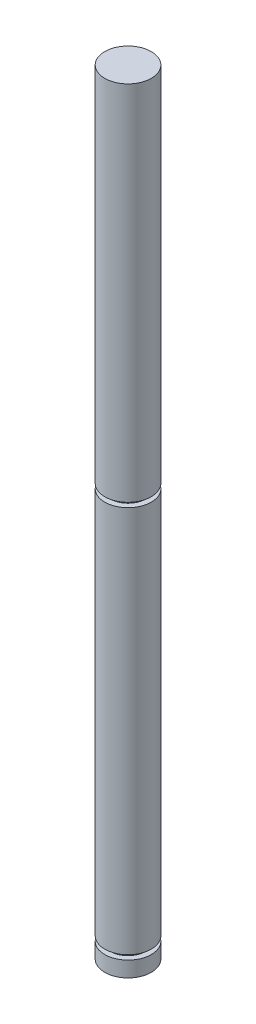
ISO-10303-21;
HEADER;
FILE_DESCRIPTION(('STEP AP214'),'2;1');
FILE_NAME('part.step','',(''),(''),'','','');
FILE_SCHEMA(('AUTOMOTIVE_DESIGN { 1 0 10303 214 1 1 1 1 }'));
ENDSEC;
DATA;
#1=APPLICATION_CONTEXT('core data for automotive mechanical design processes');
#2=APPLICATION_PROTOCOL_DEFINITION('international standard','automotive_design',2000,#1);
#3=PRODUCT_CONTEXT('',#1,'mechanical');
#4=PRODUCT('Part','Part','',(#3));
#5=PRODUCT_RELATED_PRODUCT_CATEGORY('part','',(#4));
#6=PRODUCT_DEFINITION_FORMATION('','',#4);
#7=PRODUCT_DEFINITION_CONTEXT('part definition',#1,'design');
#8=PRODUCT_DEFINITION('design','',#6,#7);
#9=PRODUCT_DEFINITION_SHAPE('','',#8);
#10=(LENGTH_UNIT() NAMED_UNIT(*) SI_UNIT(.MILLI.,.METRE.));
#11=(NAMED_UNIT(*) PLANE_ANGLE_UNIT() SI_UNIT($,.RADIAN.));
#12=(NAMED_UNIT(*) SI_UNIT($,.STERADIAN.) SOLID_ANGLE_UNIT());
#13=UNCERTAINTY_MEASURE_WITH_UNIT(LENGTH_MEASURE(1.E-05),#10,'distance_accuracy_value','');
#14=(GEOMETRIC_REPRESENTATION_CONTEXT(3) GLOBAL_UNCERTAINTY_ASSIGNED_CONTEXT((#13)) GLOBAL_UNIT_ASSIGNED_CONTEXT((#10,
#11,#12)) REPRESENTATION_CONTEXT('',''));
#15=CARTESIAN_POINT('',(0.,0.,0.));
#16=DIRECTION('',(0.,0.,1.));
#17=DIRECTION('',(1.,0.,0.));
#18=AXIS2_PLACEMENT_3D('',#15,#16,#17);
#19=CARTESIAN_POINT('',(0.,0.,0.));
#20=DIRECTION('',(0.,-1.,0.));
#21=DIRECTION('',(0.,0.,-1.));
#22=AXIS2_PLACEMENT_3D('',#19,#20,#21);
#23=PLANE('',#22);
#24=CARTESIAN_POINT('',(0.,0.,0.));
#25=DIRECTION('',(0.,-1.,0.));
#26=DIRECTION('',(0.,0.,-1.));
#27=AXIS2_PLACEMENT_3D('',#24,#25,#26);
#28=CIRCLE('',#27,7.5);
#29=CARTESIAN_POINT('',(0.,0.,-7.5));
#30=VERTEX_POINT('',#29);
#31=EDGE_CURVE('E12',#30,#30,#28,.T.);
#32=ORIENTED_EDGE('',*,*,#31,.T.);
#33=EDGE_LOOP('',(#32));
#34=FACE_BOUND('',#33,.T.);
#35=ADVANCED_FACE('F40',(#34),#23,.T.);
#36=CARTESIAN_POINT('',(0.,0.,0.));
#37=DIRECTION('',(0.,-1.,0.));
#38=DIRECTION('',(0.,0.,-1.));
#39=AXIS2_PLACEMENT_3D('',#36,#37,#38);
#40=CYLINDRICAL_SURFACE('',#39,7.5);
#41=CARTESIAN_POINT('',(0.,5.,0.));
#42=DIRECTION('',(0.,-1.,0.));
#43=DIRECTION('',(0.,0.,-1.));
#44=AXIS2_PLACEMENT_3D('',#41,#42,#43);
#45=CIRCLE('',#44,7.5);
#46=CARTESIAN_POINT('',(0.,5.,-7.5));
#47=VERTEX_POINT('',#46);
#48=EDGE_CURVE('E46',#47,#47,#45,.T.);
#49=ORIENTED_EDGE('',*,*,#48,.T.);
#50=EDGE_LOOP('',(#49));
#51=FACE_BOUND('',#50,.T.);
#52=ORIENTED_EDGE('',*,*,#31,.F.);
#53=EDGE_LOOP('',(#52));
#54=FACE_BOUND('',#53,.T.);
#55=ADVANCED_FACE('F90',(#51,#54),#40,.T.);
#56=CARTESIAN_POINT('',(7.5,5.,0.));
#57=DIRECTION('',(0.,1.,0.));
#58=DIRECTION('',(0.,0.,1.));
#59=AXIS2_PLACEMENT_3D('',#56,#57,#58);
#60=PLANE('',#59);
#61=CARTESIAN_POINT('',(0.,5.,0.));
#62=DIRECTION('',(0.,-1.,0.));
#63=DIRECTION('',(0.,0.,-1.));
#64=AXIS2_PLACEMENT_3D('',#61,#62,#63);
#65=CIRCLE('',#64,5.75);
#66=CARTESIAN_POINT('',(0.,5.,-5.75));
#67=VERTEX_POINT('',#66);
#68=EDGE_CURVE('E50',#67,#67,#65,.T.);
#69=ORIENTED_EDGE('',*,*,#68,.T.);
#70=EDGE_LOOP('',(#69));
#71=FACE_BOUND('',#70,.T.);
#72=ORIENTED_EDGE('',*,*,#48,.F.);
#73=EDGE_LOOP('',(#72));
#74=FACE_BOUND('',#73,.T.);
#75=ADVANCED_FACE('F94',(#71,#74),#60,.T.);
#76=CARTESIAN_POINT('',(0.,0.,0.));
#77=DIRECTION('',(0.,-1.,0.));
#78=DIRECTION('',(0.,0.,-1.));
#79=AXIS2_PLACEMENT_3D('',#76,#77,#78);
#80=CYLINDRICAL_SURFACE('',#79,5.75);
#81=CARTESIAN_POINT('',(0.,6.5,0.));
#82=DIRECTION('',(0.,-1.,0.));
#83=DIRECTION('',(0.,0.,-1.));
#84=AXIS2_PLACEMENT_3D('',#81,#82,#83);
#85=CIRCLE('',#84,5.75);
#86=CARTESIAN_POINT('',(0.,6.5,-5.75));
#87=VERTEX_POINT('',#86);
#88=EDGE_CURVE('E54',#87,#87,#85,.T.);
#89=ORIENTED_EDGE('',*,*,#88,.T.);
#90=EDGE_LOOP('',(#89));
#91=FACE_BOUND('',#90,.T.);
#92=ORIENTED_EDGE('',*,*,#68,.F.);
#93=EDGE_LOOP('',(#92));
#94=FACE_BOUND('',#93,.T.);
#95=ADVANCED_FACE('F98',(#91,#94),#80,.T.);
#96=CARTESIAN_POINT('',(5.75,6.5,0.));
#97=DIRECTION('',(0.,-1.,0.));
#98=DIRECTION('',(0.,0.,-1.));
#99=AXIS2_PLACEMENT_3D('',#96,#97,#98);
#100=PLANE('',#99);
#101=CARTESIAN_POINT('',(0.,6.5,0.));
#102=DIRECTION('',(0.,-1.,0.));
#103=DIRECTION('',(0.,0.,-1.));
#104=AXIS2_PLACEMENT_3D('',#101,#102,#103);
#105=CIRCLE('',#104,7.5);
#106=CARTESIAN_POINT('',(0.,6.5,-7.5));
#107=VERTEX_POINT('',#106);
#108=EDGE_CURVE('E59',#107,#107,#105,.T.);
#109=ORIENTED_EDGE('',*,*,#108,.T.);
#110=EDGE_LOOP('',(#109));
#111=FACE_BOUND('',#110,.T.);
#112=ORIENTED_EDGE('',*,*,#88,.F.);
#113=EDGE_LOOP('',(#112));
#114=FACE_BOUND('',#113,.T.);
#115=ADVANCED_FACE('F105',(#111,#114),#100,.T.);
#116=CARTESIAN_POINT('',(0.,0.,0.));
#117=DIRECTION('',(0.,-1.,0.));
#118=DIRECTION('',(0.,0.,-1.));
#119=AXIS2_PLACEMENT_3D('',#116,#117,#118);
#120=CYLINDRICAL_SURFACE('',#119,7.5);
#121=CARTESIAN_POINT('',(0.,131.5,0.));
#122=DIRECTION('',(0.,-1.,0.));
#123=DIRECTION('',(0.,0.,-1.));
#124=AXIS2_PLACEMENT_3D('',#121,#122,#123);
#125=CIRCLE('',#124,7.5);
#126=CARTESIAN_POINT('',(0.,131.5,-7.5));
#127=VERTEX_POINT('',#126);
#128=EDGE_CURVE('E62',#127,#127,#125,.T.);
#129=ORIENTED_EDGE('',*,*,#128,.T.);
#130=EDGE_LOOP('',(#129));
#131=FACE_BOUND('',#130,.T.);
#132=ORIENTED_EDGE('',*,*,#108,.F.);
#133=EDGE_LOOP('',(#132));
#134=FACE_BOUND('',#133,.T.);
#135=ADVANCED_FACE('F109',(#131,#134),#120,.T.);
#136=CARTESIAN_POINT('',(7.5,131.5,0.));
#137=DIRECTION('',(0.,1.,0.));
#138=DIRECTION('',(0.,0.,1.));
#139=AXIS2_PLACEMENT_3D('',#136,#137,#138);
#140=PLANE('',#139);
#141=CARTESIAN_POINT('',(0.,131.5,0.));
#142=DIRECTION('',(0.,-1.,0.));
#143=DIRECTION('',(0.,0.,-1.));
#144=AXIS2_PLACEMENT_3D('',#141,#142,#143);
#145=CIRCLE('',#144,5.75);
#146=CARTESIAN_POINT('',(0.,131.5,-5.75));
#147=VERTEX_POINT('',#146);
#148=EDGE_CURVE('E65',#147,#147,#145,.T.);
#149=ORIENTED_EDGE('',*,*,#148,.T.);
#150=EDGE_LOOP('',(#149));
#151=FACE_BOUND('',#150,.T.);
#152=ORIENTED_EDGE('',*,*,#128,.F.);
#153=EDGE_LOOP('',(#152));
#154=FACE_BOUND('',#153,.T.);
#155=ADVANCED_FACE('F113',(#151,#154),#140,.T.);
#156=CARTESIAN_POINT('',(0.,0.,0.));
#157=DIRECTION('',(0.,-1.,0.));
#158=DIRECTION('',(0.,0.,-1.));
#159=AXIS2_PLACEMENT_3D('',#156,#157,#158);
#160=CYLINDRICAL_SURFACE('',#159,5.75);
#161=CARTESIAN_POINT('',(0.,133.,0.));
#162=DIRECTION('',(0.,-1.,0.));
#163=DIRECTION('',(0.,0.,-1.));
#164=AXIS2_PLACEMENT_3D('',#161,#162,#163);
#165=CIRCLE('',#164,5.75);
#166=CARTESIAN_POINT('',(0.,133.,-5.75));
#167=VERTEX_POINT('',#166);
#168=EDGE_CURVE('E68',#167,#167,#165,.T.);
#169=ORIENTED_EDGE('',*,*,#168,.T.);
#170=EDGE_LOOP('',(#169));
#171=FACE_BOUND('',#170,.T.);
#172=ORIENTED_EDGE('',*,*,#148,.F.);
#173=EDGE_LOOP('',(#172));
#174=FACE_BOUND('',#173,.T.);
#175=ADVANCED_FACE('F117',(#171,#174),#160,.T.);
#176=CARTESIAN_POINT('',(5.75,133.,0.));
#177=DIRECTION('',(0.,-1.,0.));
#178=DIRECTION('',(0.,0.,-1.));
#179=AXIS2_PLACEMENT_3D('',#176,#177,#178);
#180=PLANE('',#179);
#181=CARTESIAN_POINT('',(0.,133.,0.));
#182=DIRECTION('',(0.,-1.,0.));
#183=DIRECTION('',(0.,0.,-1.));
#184=AXIS2_PLACEMENT_3D('',#181,#182,#183);
#185=CIRCLE('',#184,7.5);
#186=CARTESIAN_POINT('',(0.,133.,-7.5));
#187=VERTEX_POINT('',#186);
#188=EDGE_CURVE('E71',#187,#187,#185,.T.);
#189=ORIENTED_EDGE('',*,*,#188,.T.);
#190=EDGE_LOOP('',(#189));
#191=FACE_BOUND('',#190,.T.);
#192=ORIENTED_EDGE('',*,*,#168,.F.);
#193=EDGE_LOOP('',(#192));
#194=FACE_BOUND('',#193,.T.);
#195=ADVANCED_FACE('F87',(#191,#194),#180,.T.);
#196=CARTESIAN_POINT('',(0.,0.,0.));
#197=DIRECTION('',(0.,-1.,0.));
#198=DIRECTION('',(0.,0.,-1.));
#199=AXIS2_PLACEMENT_3D('',#196,#197,#198);
#200=CYLINDRICAL_SURFACE('',#199,7.5);
#201=CARTESIAN_POINT('',(0.,250.,0.));
#202=DIRECTION('',(0.,-1.,0.));
#203=DIRECTION('',(0.,0.,-1.));
#204=AXIS2_PLACEMENT_3D('',#201,#202,#203);
#205=CIRCLE('',#204,7.5);
#206=CARTESIAN_POINT('',(0.,250.,-7.5));
#207=VERTEX_POINT('',#206);
#208=EDGE_CURVE('E74',#207,#207,#205,.T.);
#209=ORIENTED_EDGE('',*,*,#208,.T.);
#210=EDGE_LOOP('',(#209));
#211=FACE_BOUND('',#210,.T.);
#212=ORIENTED_EDGE('',*,*,#188,.F.);
#213=EDGE_LOOP('',(#212));
#214=FACE_BOUND('',#213,.T.);
#215=ADVANCED_FACE('F78',(#211,#214),#200,.T.);
#216=CARTESIAN_POINT('',(7.5,250.,0.));
#217=DIRECTION('',(0.,1.,0.));
#218=DIRECTION('',(0.,0.,1.));
#219=AXIS2_PLACEMENT_3D('',#216,#217,#218);
#220=PLANE('',#219);
#221=ORIENTED_EDGE('',*,*,#208,.F.);
#222=EDGE_LOOP('',(#221));
#223=FACE_BOUND('',#222,.T.);
#224=ADVANCED_FACE('F81',(#223),#220,.T.);
#225=CLOSED_SHELL('',(#35,#55,#75,#95,#115,#135,#155,#175,#195,#215,#224));
#226=MANIFOLD_SOLID_BREP('B2',#225);
#227=ADVANCED_BREP_SHAPE_REPRESENTATION('',(#18,#226),#14);
#228=SHAPE_DEFINITION_REPRESENTATION(#9,#227);
ENDSEC;
END-ISO-10303-21;
